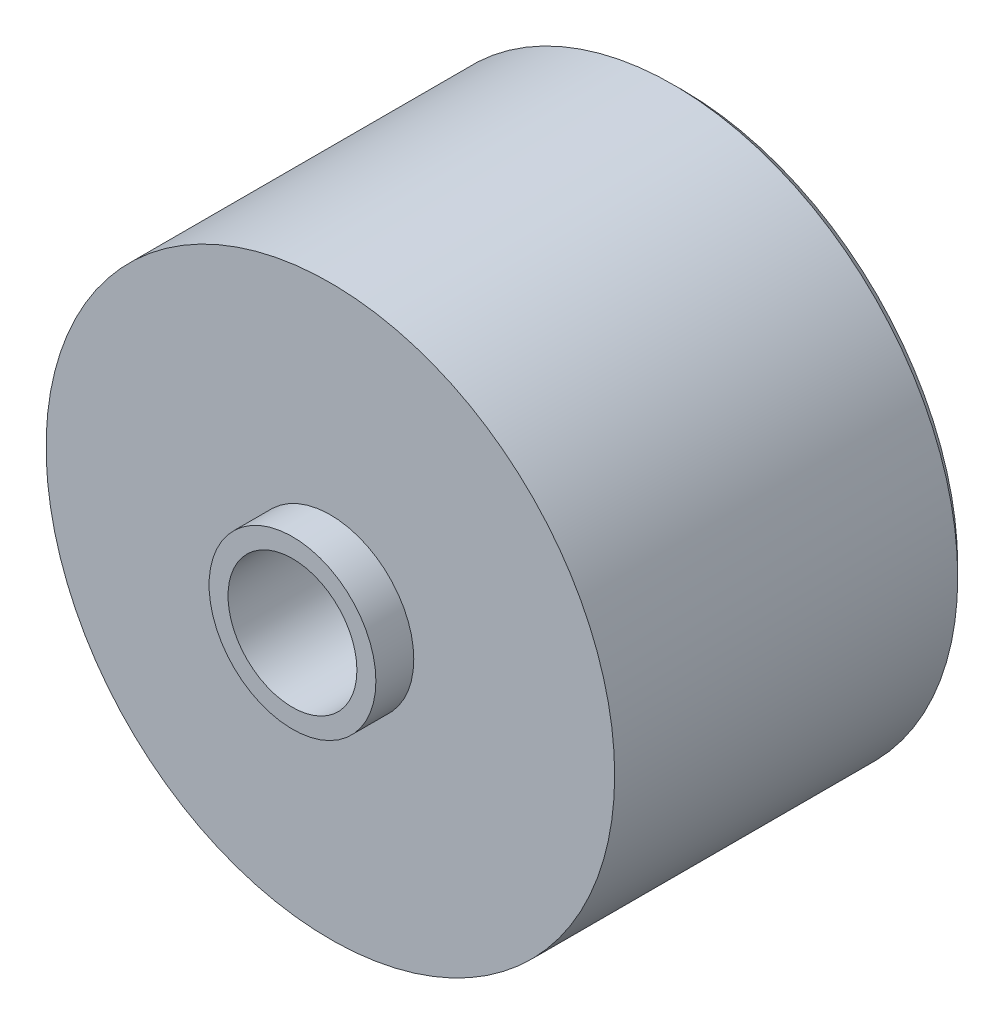
ISO-10303-21;
HEADER;
FILE_DESCRIPTION(('STEP AP214'),'2;1');
FILE_NAME('part.step','',(''),(''),'','','');
FILE_SCHEMA(('AUTOMOTIVE_DESIGN { 1 0 10303 214 1 1 1 1 }'));
ENDSEC;
DATA;
#1=APPLICATION_CONTEXT('core data for automotive mechanical design processes');
#2=APPLICATION_PROTOCOL_DEFINITION('international standard','automotive_design',2000,#1);
#3=PRODUCT_CONTEXT('',#1,'mechanical');
#4=PRODUCT('Part','Part','',(#3));
#5=PRODUCT_RELATED_PRODUCT_CATEGORY('part','',(#4));
#6=PRODUCT_DEFINITION_FORMATION('','',#4);
#7=PRODUCT_DEFINITION_CONTEXT('part definition',#1,'design');
#8=PRODUCT_DEFINITION('design','',#6,#7);
#9=PRODUCT_DEFINITION_SHAPE('','',#8);
#10=(LENGTH_UNIT() NAMED_UNIT(*) SI_UNIT(.MILLI.,.METRE.));
#11=(NAMED_UNIT(*) PLANE_ANGLE_UNIT() SI_UNIT($,.RADIAN.));
#12=(NAMED_UNIT(*) SI_UNIT($,.STERADIAN.) SOLID_ANGLE_UNIT());
#13=UNCERTAINTY_MEASURE_WITH_UNIT(LENGTH_MEASURE(1.E-05),#10,'distance_accuracy_value','');
#14=(GEOMETRIC_REPRESENTATION_CONTEXT(3) GLOBAL_UNCERTAINTY_ASSIGNED_CONTEXT((#13)) GLOBAL_UNIT_ASSIGNED_CONTEXT((#10,
#11,#12)) REPRESENTATION_CONTEXT('',''));
#15=CARTESIAN_POINT('',(0.,0.,0.));
#16=DIRECTION('',(0.,0.,1.));
#17=DIRECTION('',(1.,0.,0.));
#18=AXIS2_PLACEMENT_3D('',#15,#16,#17);
#19=CARTESIAN_POINT('',(0.,0.,9.3));
#20=DIRECTION('',(0.,0.,1.));
#21=DIRECTION('',(1.,0.,0.));
#22=AXIS2_PLACEMENT_3D('',#19,#20,#21);
#23=PLANE('',#22);
#24=CARTESIAN_POINT('',(0.,0.,9.3));
#25=DIRECTION('',(0.,0.,1.));
#26=DIRECTION('',(1.,0.,0.));
#27=AXIS2_PLACEMENT_3D('',#24,#25,#26);
#28=CIRCLE('',#27,7.5);
#29=CARTESIAN_POINT('',(7.5,0.,9.3));
#30=VERTEX_POINT('',#29);
#31=EDGE_CURVE('E64',#30,#30,#28,.T.);
#32=ORIENTED_EDGE('',*,*,#31,.T.);
#33=EDGE_LOOP('',(#32));
#34=FACE_BOUND('',#33,.T.);
#35=CARTESIAN_POINT('',(0.,0.,9.3));
#36=DIRECTION('',(0.,0.,1.));
#37=DIRECTION('',(1.,0.,0.));
#38=AXIS2_PLACEMENT_3D('',#35,#36,#37);
#39=CIRCLE('',#38,2.2);
#40=CARTESIAN_POINT('',(2.2,0.,9.3));
#41=VERTEX_POINT('',#40);
#42=EDGE_CURVE('E69',#41,#41,#39,.T.);
#43=ORIENTED_EDGE('',*,*,#42,.F.);
#44=EDGE_LOOP('',(#43));
#45=FACE_BOUND('',#44,.T.);
#46=ADVANCED_FACE('F39',(#34,#45),#23,.T.);
#47=CARTESIAN_POINT('',(0.,0.,0.));
#48=DIRECTION('',(0.,0.,1.));
#49=DIRECTION('',(1.,0.,0.));
#50=AXIS2_PLACEMENT_3D('',#47,#48,#49);
#51=PLANE('',#50);
#52=CARTESIAN_POINT('',(0.,0.,0.));
#53=DIRECTION('',(0.,0.,1.));
#54=DIRECTION('',(1.,0.,0.));
#55=AXIS2_PLACEMENT_3D('',#52,#53,#54);
#56=CIRCLE('',#55,1.95);
#57=CARTESIAN_POINT('',(1.95,0.,0.));
#58=VERTEX_POINT('',#57);
#59=EDGE_CURVE('E53',#58,#58,#56,.T.);
#60=ORIENTED_EDGE('',*,*,#59,.T.);
#61=EDGE_LOOP('',(#60));
#62=FACE_BOUND('',#61,.T.);
#63=CARTESIAN_POINT('',(0.,0.,0.));
#64=DIRECTION('',(0.,0.,1.));
#65=DIRECTION('',(1.,0.,0.));
#66=AXIS2_PLACEMENT_3D('',#63,#64,#65);
#67=CIRCLE('',#66,7.25);
#68=CARTESIAN_POINT('',(7.25,0.,0.));
#69=VERTEX_POINT('',#68);
#70=EDGE_CURVE('E58',#69,#69,#67,.F.);
#71=ORIENTED_EDGE('',*,*,#70,.T.);
#72=EDGE_LOOP('',(#71));
#73=FACE_BOUND('',#72,.T.);
#74=ADVANCED_FACE('F98',(#62,#73),#51,.F.);
#75=CARTESIAN_POINT('',(0.,0.,9.3));
#76=DIRECTION('',(0.,0.,-1.));
#77=DIRECTION('',(-1.,0.,0.));
#78=AXIS2_PLACEMENT_3D('',#75,#76,#77);
#79=CYLINDRICAL_SURFACE('',#78,7.5);
#80=CARTESIAN_POINT('',(0.,0.,0.249999999999999));
#81=DIRECTION('',(0.,0.,1.));
#82=DIRECTION('',(1.,0.,0.));
#83=AXIS2_PLACEMENT_3D('',#80,#81,#82);
#84=CIRCLE('',#83,7.5);
#85=CARTESIAN_POINT('',(7.5,0.,0.249999999999999));
#86=VERTEX_POINT('',#85);
#87=EDGE_CURVE('E10',#86,#86,#84,.T.);
#88=ORIENTED_EDGE('',*,*,#87,.T.);
#89=EDGE_LOOP('',(#88));
#90=FACE_BOUND('',#89,.T.);
#91=ORIENTED_EDGE('',*,*,#31,.F.);
#92=EDGE_LOOP('',(#91));
#93=FACE_BOUND('',#92,.T.);
#94=ADVANCED_FACE('F95',(#90,#93),#79,.T.);
#95=CARTESIAN_POINT('',(0.,0.,9.3));
#96=DIRECTION('',(0.,0.,-1.));
#97=DIRECTION('',(-1.,0.,0.));
#98=AXIS2_PLACEMENT_3D('',#95,#96,#97);
#99=CYLINDRICAL_SURFACE('',#98,1.7);
#100=CARTESIAN_POINT('',(0.,0.,0.250000000000007));
#101=DIRECTION('',(0.,0.,1.));
#102=DIRECTION('',(1.,0.,0.));
#103=AXIS2_PLACEMENT_3D('',#100,#101,#102);
#104=CIRCLE('',#103,1.7);
#105=CARTESIAN_POINT('',(1.7,0.,0.250000000000007));
#106=VERTEX_POINT('',#105);
#107=EDGE_CURVE('E48',#106,#106,#104,.F.);
#108=ORIENTED_EDGE('',*,*,#107,.T.);
#109=EDGE_LOOP('',(#108));
#110=FACE_BOUND('',#109,.T.);
#111=CARTESIAN_POINT('',(0.,0.,10.3));
#112=DIRECTION('',(0.,0.,1.));
#113=DIRECTION('',(1.,0.,0.));
#114=AXIS2_PLACEMENT_3D('',#111,#112,#113);
#115=CIRCLE('',#114,1.7);
#116=CARTESIAN_POINT('',(1.7,0.,10.3));
#117=VERTEX_POINT('',#116);
#118=EDGE_CURVE('E73',#117,#117,#115,.T.);
#119=ORIENTED_EDGE('',*,*,#118,.T.);
#120=EDGE_LOOP('',(#119));
#121=FACE_BOUND('',#120,.T.);
#122=ADVANCED_FACE('F81',(#110,#121),#99,.F.);
#123=CARTESIAN_POINT('',(0.,0.,10.3));
#124=DIRECTION('',(0.,0.,1.));
#125=DIRECTION('',(1.,0.,0.));
#126=AXIS2_PLACEMENT_3D('',#123,#124,#125);
#127=PLANE('',#126);
#128=CARTESIAN_POINT('',(0.,0.,10.3));
#129=DIRECTION('',(0.,0.,1.));
#130=DIRECTION('',(1.,0.,0.));
#131=AXIS2_PLACEMENT_3D('',#128,#129,#130);
#132=CIRCLE('',#131,2.2);
#133=CARTESIAN_POINT('',(2.2,0.,10.3));
#134=VERTEX_POINT('',#133);
#135=EDGE_CURVE('E68',#134,#134,#132,.T.);
#136=ORIENTED_EDGE('',*,*,#135,.T.);
#137=EDGE_LOOP('',(#136));
#138=FACE_BOUND('',#137,.T.);
#139=ORIENTED_EDGE('',*,*,#118,.F.);
#140=EDGE_LOOP('',(#139));
#141=FACE_BOUND('',#140,.T.);
#142=ADVANCED_FACE('F83',(#138,#141),#127,.T.);
#143=CARTESIAN_POINT('',(0.,0.,10.3));
#144=DIRECTION('',(0.,0.,-1.));
#145=DIRECTION('',(-1.,0.,0.));
#146=AXIS2_PLACEMENT_3D('',#143,#144,#145);
#147=CYLINDRICAL_SURFACE('',#146,2.2);
#148=ORIENTED_EDGE('',*,*,#135,.F.);
#149=EDGE_LOOP('',(#148));
#150=FACE_BOUND('',#149,.T.);
#151=ORIENTED_EDGE('',*,*,#42,.T.);
#152=EDGE_LOOP('',(#151));
#153=FACE_BOUND('',#152,.T.);
#154=ADVANCED_FACE('F85',(#150,#153),#147,.T.);
#155=CARTESIAN_POINT('',(0.,0.,0.));
#156=DIRECTION('',(0.,0.,-1.));
#157=DIRECTION('',(-1.,0.,0.));
#158=AXIS2_PLACEMENT_3D('',#155,#156,#157);
#159=CONICAL_SURFACE('',#158,1.95,0.785398163397442);
#160=ORIENTED_EDGE('',*,*,#107,.F.);
#161=EDGE_LOOP('',(#160));
#162=FACE_BOUND('',#161,.T.);
#163=ORIENTED_EDGE('',*,*,#59,.F.);
#164=EDGE_LOOP('',(#163));
#165=FACE_BOUND('',#164,.T.);
#166=ADVANCED_FACE('F92',(#162,#165),#159,.F.);
#167=CARTESIAN_POINT('',(0.,0.,0.249999999999999));
#168=DIRECTION('',(0.,0.,1.));
#169=DIRECTION('',(1.,0.,0.));
#170=AXIS2_PLACEMENT_3D('',#167,#168,#169);
#171=CONICAL_SURFACE('',#170,7.5,0.78539816339745);
#172=ORIENTED_EDGE('',*,*,#70,.F.);
#173=EDGE_LOOP('',(#172));
#174=FACE_BOUND('',#173,.T.);
#175=ORIENTED_EDGE('',*,*,#87,.F.);
#176=EDGE_LOOP('',(#175));
#177=FACE_BOUND('',#176,.T.);
#178=ADVANCED_FACE('F42',(#174,#177),#171,.T.);
#179=CLOSED_SHELL('',(#46,#74,#94,#122,#142,#154,#166,#178));
#180=MANIFOLD_SOLID_BREP('B2',#179);
#181=ADVANCED_BREP_SHAPE_REPRESENTATION('',(#18,#180),#14);
#182=SHAPE_DEFINITION_REPRESENTATION(#9,#181);
ENDSEC;
END-ISO-10303-21;
